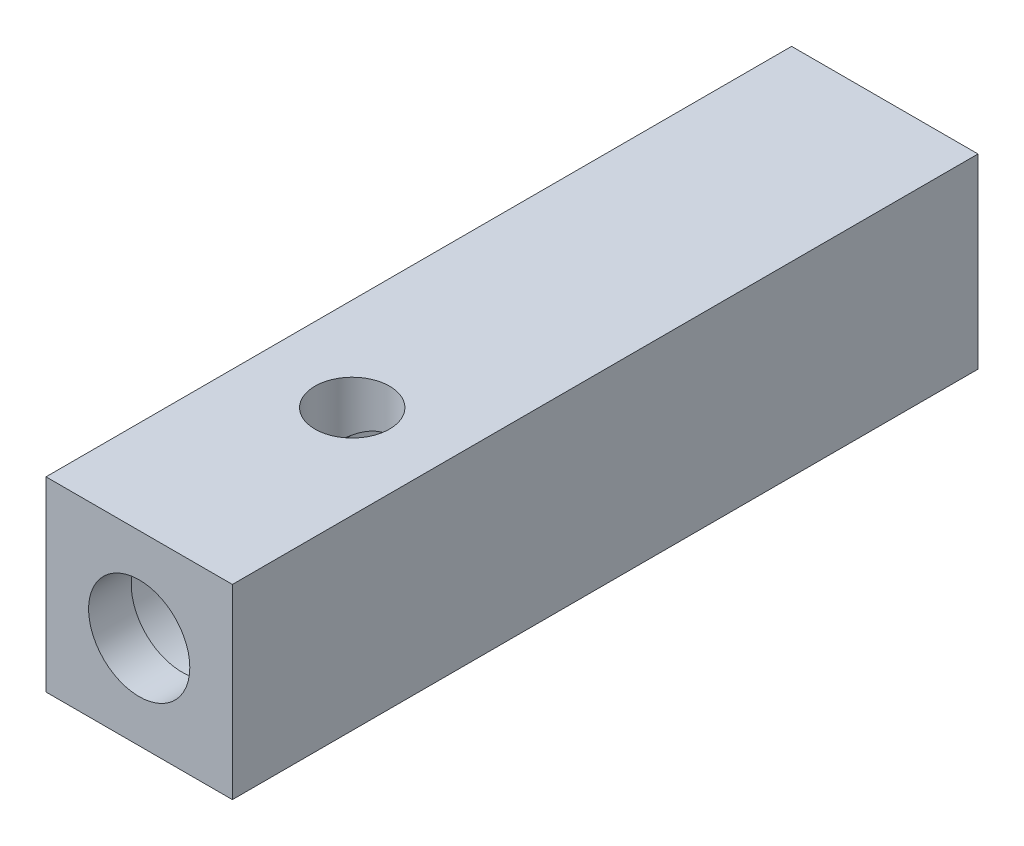
ISO-10303-21;
HEADER;
FILE_DESCRIPTION(('STEP AP214'),'2;1');
FILE_NAME('part.step','',(''),(''),'','','');
FILE_SCHEMA(('AUTOMOTIVE_DESIGN { 1 0 10303 214 1 1 1 1 }'));
ENDSEC;
DATA;
#1=APPLICATION_CONTEXT('core data for automotive mechanical design processes');
#2=APPLICATION_PROTOCOL_DEFINITION('international standard','automotive_design',2000,#1);
#3=PRODUCT_CONTEXT('',#1,'mechanical');
#4=PRODUCT('Part','Part','',(#3));
#5=PRODUCT_RELATED_PRODUCT_CATEGORY('part','',(#4));
#6=PRODUCT_DEFINITION_FORMATION('','',#4);
#7=PRODUCT_DEFINITION_CONTEXT('part definition',#1,'design');
#8=PRODUCT_DEFINITION('design','',#6,#7);
#9=PRODUCT_DEFINITION_SHAPE('','',#8);
#10=(LENGTH_UNIT() NAMED_UNIT(*) SI_UNIT(.MILLI.,.METRE.));
#11=(NAMED_UNIT(*) PLANE_ANGLE_UNIT() SI_UNIT($,.RADIAN.));
#12=(NAMED_UNIT(*) SI_UNIT($,.STERADIAN.) SOLID_ANGLE_UNIT());
#13=UNCERTAINTY_MEASURE_WITH_UNIT(LENGTH_MEASURE(1.E-05),#10,'distance_accuracy_value','');
#14=(GEOMETRIC_REPRESENTATION_CONTEXT(3) GLOBAL_UNCERTAINTY_ASSIGNED_CONTEXT((#13)) GLOBAL_UNIT_ASSIGNED_CONTEXT((#10,
#11,#12)) REPRESENTATION_CONTEXT('',''));
#15=CARTESIAN_POINT('',(0.,0.,0.));
#16=DIRECTION('',(0.,0.,1.));
#17=DIRECTION('',(1.,0.,0.));
#18=AXIS2_PLACEMENT_3D('',#15,#16,#17);
#19=CARTESIAN_POINT('',(-0.749999999999997,-0.854838709677421,130.));
#20=DIRECTION('',(0.,0.,-1.));
#21=DIRECTION('',(-1.,0.,0.));
#22=AXIS2_PLACEMENT_3D('',#19,#20,#21);
#23=CYLINDRICAL_SURFACE('',#22,4.75);
#24=CARTESIAN_POINT('',(-0.750000000000002,-5.60483870967742,33.5));
#25=CARTESIAN_POINT('',(-0.835960235276341,-5.60483892022391,33.5000002182446));
#26=CARTESIAN_POINT('',(-0.921917443498972,-5.60250047964921,33.496828661841));
#27=CARTESIAN_POINT('',(-1.0931473212692,-5.59320394208142,33.484196212037));
#28=CARTESIAN_POINT('',(-1.1784197208088,-5.58624410553636,33.4747329503574));
#29=CARTESIAN_POINT('',(-1.34756129725432,-5.56786886904828,33.4496704863325));
#30=CARTESIAN_POINT('',(-1.43143062071384,-5.55645393751593,33.4340719290535));
#31=CARTESIAN_POINT('',(-1.59718128514274,-5.52943517180864,33.3969855039154));
#32=CARTESIAN_POINT('',(-1.679061747263,-5.51382952125771,33.3754950822711));
#33=CARTESIAN_POINT('',(-1.91998623850274,-5.46140569671407,33.3028923506507));
#34=CARTESIAN_POINT('',(-2.0753828679131,-5.41885812369078,33.2434849718806));
#35=CARTESIAN_POINT('',(-2.37300677003142,-5.32171064524888,33.1052943255271));
#36=CARTESIAN_POINT('',(-2.51523220787309,-5.26710906417225,33.0265083639039));
#37=CARTESIAN_POINT('',(-2.7973436223757,-5.14397308430873,32.8441373772734));
#38=CARTESIAN_POINT('',(-2.93582556798973,-5.07462107872646,32.7389431380303));
#39=CARTESIAN_POINT('',(-3.1944093869012,-4.93029137657298,32.5109068045485));
#40=CARTESIAN_POINT('',(-3.31448336892524,-4.85530539474581,32.3880384663797));
#41=CARTESIAN_POINT('',(-3.49090600459096,-4.73508875808077,32.1789712052844));
#42=CARTESIAN_POINT('',(-3.55348464878972,-4.68999881311107,32.0978552786358));
#43=CARTESIAN_POINT('',(-3.67156137843959,-4.60082944136122,31.9300285315039));
#44=CARTESIAN_POINT('',(-3.72705739807501,-4.55675031247088,31.8433160897181));
#45=CARTESIAN_POINT('',(-3.83057745172816,-4.47105938451772,31.6645408128963));
#46=CARTESIAN_POINT('',(-3.87861105004513,-4.4294444702389,31.5724850376962));
#47=CARTESIAN_POINT('',(-3.96684709051101,-4.35025140654459,31.3830455383964));
#48=CARTESIAN_POINT('',(-4.00705071709724,-4.31267264696761,31.2856626229905));
#49=CARTESIAN_POINT('',(-4.09084182285504,-4.23206746322691,31.052930280201));
#50=CARTESIAN_POINT('',(-4.13122394035352,-4.19128872443804,30.91559341532));
#51=CARTESIAN_POINT('',(-4.19518557475051,-4.12521342144265,30.6336429883523));
#52=CARTESIAN_POINT('',(-4.21880316840151,-4.09988179126655,30.4890467200087));
#53=CARTESIAN_POINT('',(-4.24772910565033,-4.06869869874495,30.1946407372326));
#54=CARTESIAN_POINT('',(-4.25289054771124,-4.06300354546502,30.0447987381071));
#55=CARTESIAN_POINT('',(-4.24399273179437,-4.07268541654341,29.7463366737651));
#56=CARTESIAN_POINT('',(-4.22992102881128,-4.08807608471574,29.5977174623844));
#57=CARTESIAN_POINT('',(-4.18137531080706,-4.13957542076199,29.2913234899478));
#58=CARTESIAN_POINT('',(-4.144920941132,-4.17768303374194,29.1342174184615));
#59=CARTESIAN_POINT('',(-4.05264272092886,-4.26940046845676,28.8304345814692));
#60=CARTESIAN_POINT('',(-3.99677267075352,-4.32304721443486,28.6837837062929));
#61=CARTESIAN_POINT('',(-3.88859825932271,-4.42067566838978,28.4475042977926));
#62=CARTESIAN_POINT('',(-3.84090331128877,-4.46223426837937,28.3546793056552));
#63=CARTESIAN_POINT('',(-3.73801427391982,-4.54790621789404,28.1744762736389));
#64=CARTESIAN_POINT('',(-3.68281795259838,-4.5920203255444,28.0870998662834));
#65=CARTESIAN_POINT('',(-3.56519867241594,-4.6814064874249,27.9178651039498));
#66=CARTESIAN_POINT('',(-3.50276924280806,-4.72667954981198,27.836011795137));
#67=CARTESIAN_POINT('',(-3.37092112966284,-4.81711886570695,27.6780711547123));
#68=CARTESIAN_POINT('',(-3.30150223526948,-4.86228511595047,27.6019839971732));
#69=CARTESIAN_POINT('',(-3.15472617312422,-4.95207006594129,27.454757729243));
#70=CARTESIAN_POINT('',(-3.07726468796293,-4.99667010830168,27.3837110277874));
#71=CARTESIAN_POINT('',(-2.91547996244503,-5.08350583300548,27.248305597915));
#72=CARTESIAN_POINT('',(-2.83115761286572,-5.12574182108674,27.1839460037433));
#73=CARTESIAN_POINT('',(-2.6560297485777,-5.20671571863305,27.0625909510671));
#74=CARTESIAN_POINT('',(-2.56523632609718,-5.24545986137626,27.0055822887843));
#75=CARTESIAN_POINT('',(-2.37747132728796,-5.31846874059756,26.8995211569268));
#76=CARTESIAN_POINT('',(-2.28050207779676,-5.35273514945381,26.8504657152656));
#77=CARTESIAN_POINT('',(-2.03213223215877,-5.431172250699,26.7392379103048));
#78=CARTESIAN_POINT('',(-1.87723908996274,-5.4720291861753,26.6823271189342));
#79=CARTESIAN_POINT('',(-1.55799582319744,-5.53844743912448,26.5904991901329));
#80=CARTESIAN_POINT('',(-1.39365280335538,-5.56402008717532,26.5555657593888));
#81=CARTESIAN_POINT('',(-1.05914917232649,-5.59775596573782,26.5095825029298));
#82=CARTESIAN_POINT('',(-0.888967815571888,-5.6058487395314,26.4986293328553));
#83=CARTESIAN_POINT('',(-0.548947307756921,-5.60362580756333,26.5016459962613));
#84=CARTESIAN_POINT('',(-0.379108152651954,-5.5933103206685,26.5156155334209));
#85=CARTESIAN_POINT('',(-0.0558015782133216,-5.55647773396524,26.5658809205757));
#86=CARTESIAN_POINT('',(0.0980224871730821,-5.53102464018638,26.6007115166988));
#87=CARTESIAN_POINT('',(0.397029181154265,-5.46680484784143,26.6896112295242));
#88=CARTESIAN_POINT('',(0.542209985252461,-5.42803534993969,26.7436843914287));
#89=CARTESIAN_POINT('',(0.832242946594377,-5.33634524975176,26.8737093733923));
#90=CARTESIAN_POINT('',(0.97620352395673,-5.28256289990077,26.951028525703));
#91=CARTESIAN_POINT('',(1.24948743646971,-5.16606336427905,27.1228237449417));
#92=CARTESIAN_POINT('',(1.37880207352696,-5.10334091848265,27.2173099213738));
#93=CARTESIAN_POINT('',(1.64416252012856,-4.96058232699432,27.4400648399105));
#94=CARTESIAN_POINT('',(1.77709933002467,-4.87947970482023,27.5713513376227));
#95=CARTESIAN_POINT('',(2.02037654106611,-4.71605527014465,27.8529793694197));
#96=CARTESIAN_POINT('',(2.13069442799828,-4.63373232950934,28.0033396503974));
#97=CARTESIAN_POINT('',(2.31853300761375,-4.48248417032775,28.3078977864141));
#98=CARTESIAN_POINT('',(2.39810032870962,-4.41301877945663,28.4605595861629));
#99=CARTESIAN_POINT('',(2.53520371737235,-4.28683739429773,28.7803464443351));
#100=CARTESIAN_POINT('',(2.5927853303969,-4.2300951446547,28.9474407136931));
#101=CARTESIAN_POINT('',(2.67201794351727,-4.14948843737931,29.2527608978894));
#102=CARTESIAN_POINT('',(2.69896373511458,-4.12100976440798,29.3883629372417));
#103=CARTESIAN_POINT('',(2.73661775343226,-4.08079437132936,29.6641616676011));
#104=CARTESIAN_POINT('',(2.74735224962139,-4.06903056757511,29.8043505483855));
#105=CARTESIAN_POINT('',(2.75178455340328,-4.06420381499295,30.0857216759805));
#106=CARTESIAN_POINT('',(2.7454359733717,-4.07119178485177,30.2269055871465));
#107=CARTESIAN_POINT('',(2.71613321909268,-4.102737662142,30.5055932471552));
#108=CARTESIAN_POINT('',(2.69315600027368,-4.12731995189973,30.6430916139135));
#109=CARTESIAN_POINT('',(2.62365978492096,-4.19909025266691,30.9482838446297));
#110=CARTESIAN_POINT('',(2.57239318459059,-4.25064518326572,31.1138359662066));
#111=CARTESIAN_POINT('',(2.44840779264907,-4.36766121832534,31.4315825086133));
#112=CARTESIAN_POINT('',(2.37563639417373,-4.43315631318023,31.58374297089));
#113=CARTESIAN_POINT('',(2.24029231563935,-4.54610472899651,31.8219851291503));
#114=CARTESIAN_POINT('',(2.18335217571275,-4.59165247626422,31.9122654275547));
#115=CARTESIAN_POINT('',(2.06181652433762,-4.68393775074415,32.086864053777));
#116=CARTESIAN_POINT('',(1.99722223229462,-4.73067508751027,32.171183327855));
#117=CARTESIAN_POINT('',(1.86056387669929,-4.8240088977339,32.3337171165019));
#118=CARTESIAN_POINT('',(1.78849522416099,-4.87060526635934,32.4119278283632));
#119=CARTESIAN_POINT('',(1.63707984240252,-4.96241569274556,32.5618745665306));
#120=CARTESIAN_POINT('',(1.55773261043076,-5.00762965473165,32.6336101449014));
#121=CARTESIAN_POINT('',(1.39164910343152,-5.09567644817136,32.770370101137));
#122=CARTESIAN_POINT('',(1.30488746459781,-5.13850020424953,32.8353696097816));
#123=CARTESIAN_POINT('',(1.124533934609,-5.22043426260144,32.9576993070876));
#124=CARTESIAN_POINT('',(1.03094600588811,-5.25954668931184,33.0150338910802));
#125=CARTESIAN_POINT('',(0.837482942272111,-5.33290543654738,33.1212260831418));
#126=CARTESIAN_POINT('',(0.737618712517211,-5.36715987801866,33.1700978691821));
#127=CARTESIAN_POINT('',(0.532131269502087,-5.42978803621756,33.2586255691418));
#128=CARTESIAN_POINT('',(0.426510247290423,-5.4581639708481,33.298284959495));
#129=CARTESIAN_POINT('',(0.233595368558578,-5.50270269821314,33.3601330370715));
#130=CARTESIAN_POINT('',(0.147216529163855,-5.52017959903707,33.3842442135132));
#131=CARTESIAN_POINT('',(-0.0279068065408229,-5.55047191626987,33.4258832467202));
#132=CARTESIAN_POINT('',(-0.116650745028688,-5.56328842159748,33.4434126413743));
#133=CARTESIAN_POINT('',(-0.295735691018596,-5.58392558052667,33.4715780849901));
#134=CARTESIAN_POINT('',(-0.386075493272035,-5.59174985148234,33.4822191253088));
#135=CARTESIAN_POINT('',(-0.56761134679428,-5.60220624004334,33.4964298794323));
#136=CARTESIAN_POINT('',(-0.658807376788176,-5.604838486315,33.4999997684709));
#137=CARTESIAN_POINT('',(-0.750000000000002,-5.60483870967742,33.5));
#138=B_SPLINE_CURVE_WITH_KNOTS('',3,(#24,#25,#26,#27,#28,#29,#30,#31,#32,#33,#34,#35,#36,#37,
#38,#39,#40,#41,#42,#43,#44,#45,#46,#47,#48,#49,#50,#51,#52,#53,#54,#55,#56,#57,#58,#59,#60,#61,
#62,#63,#64,#65,#66,#67,#68,#69,#70,#71,#72,#73,#74,#75,#76,#77,#78,#79,#80,#81,#82,#83,#84,#85,
#86,#87,#88,#89,#90,#91,#92,#93,#94,#95,#96,#97,#98,#99,#100,#101,#102,#103,#104,#105,#106,#107,
#108,#109,#110,#111,#112,#113,#114,#115,#116,#117,#118,#119,#120,#121,#122,#123,#124,#125,#126,
#127,#128,#129,#130,#131,#132,#133,#134,#135,#136,#137),.UNSPECIFIED.,.T.,.F.,(4,2,2,2,2,2,2,2,
2,2,2,2,2,2,2,2,2,2,2,2,2,2,2,2,2,2,2,2,2,2,2,2,2,2,2,2,2,2,2,2,2,2,2,2,2,2,2,2,2,2,2,2,2,2,2,2,
4),(0.,0.2577856007201,0.515668290253106,0.773523873186251,1.03149139890406,1.5442023985348,
2.05698471634416,2.61667257627068,3.17720025327256,3.51268407972365,3.84826553545024,
4.18341327654955,4.51851028051266,4.96337320731081,5.40722246913762,5.8545967766865,
6.30226069948906,6.79675625774903,7.29243661832322,7.62904818929507,7.96576013710248,
8.30277566811493,8.63980136915569,8.981932187439,9.32401865598431,9.66548184410365,
10.0068171332068,10.5145311397974,11.0218682984985,11.5312466113961,12.0406188680309,
12.5178319253915,12.99514536255,13.5093274117729,14.023813245376,14.6325789718054,
15.2419477352069,15.7970128751745,16.350921824934,16.7726768674582,17.1937477441812,
17.6159631556711,18.0387648118245,18.5782747472135,19.1191155599946,19.4668912183488,
19.8146115458402,20.1625466392057,20.5105057835326,20.8597069479482,21.2087070015448,
21.5571165862709,21.9053944791134,22.1791407700711,22.4528230580284,22.7263068109511,
22.9997837864425),.UNSPECIFIED.);
#139=CARTESIAN_POINT('',(-0.750000000000002,-5.60483870967742,33.5));
#140=VERTEX_POINT('',#139);
#141=EDGE_CURVE('E263',#140,#140,#138,.T.);
#142=ORIENTED_EDGE('',*,*,#141,.T.);
#143=EDGE_LOOP('',(#142));
#144=FACE_BOUND('',#143,.T.);
#145=CARTESIAN_POINT('',(-0.750000000000002,3.89516129032258,33.5));
#146=CARTESIAN_POINT('',(-0.664039764723662,3.89516150086907,33.5000002182446));
#147=CARTESIAN_POINT('',(-0.578082556501032,3.89282306029437,33.496828661841));
#148=CARTESIAN_POINT('',(-0.406852678730803,3.88352652272658,33.484196212037));
#149=CARTESIAN_POINT('',(-0.321580279191206,3.87656668618152,33.4747329503574));
#150=CARTESIAN_POINT('',(-0.152438702745682,3.85819144969344,33.4496704863325));
#151=CARTESIAN_POINT('',(-0.0685693792861652,3.84677651816109,33.4340719290535));
#152=CARTESIAN_POINT('',(0.0971812851427338,3.8197577524538,33.3969855039154));
#153=CARTESIAN_POINT('',(0.179061747262998,3.80415210190287,33.3754950822711));
#154=CARTESIAN_POINT('',(0.419986238502736,3.75172827735923,33.3028923506507));
#155=CARTESIAN_POINT('',(0.575382867913099,3.70918070433594,33.2434849718806));
#156=CARTESIAN_POINT('',(0.873006770031417,3.61203322589405,33.1052943255271));
#157=CARTESIAN_POINT('',(1.01523220787309,3.55743164481741,33.0265083639039));
#158=CARTESIAN_POINT('',(1.2973436223757,3.43429566495389,32.8441373772734));
#159=CARTESIAN_POINT('',(1.43582556798973,3.36494365937162,32.7389431380303));
#160=CARTESIAN_POINT('',(1.69440938690119,3.22061395721814,32.5109068045485));
#161=CARTESIAN_POINT('',(1.81448336892524,3.14562797539098,32.3880384663797));
#162=CARTESIAN_POINT('',(1.99090600459095,3.02541133872593,32.1789712052844));
#163=CARTESIAN_POINT('',(2.05348464878971,2.98032139375623,32.0978552786358));
#164=CARTESIAN_POINT('',(2.17156137843958,2.89115202200639,31.9300285315039));
#165=CARTESIAN_POINT('',(2.227057398075,2.84707289311605,31.8433160897181));
#166=CARTESIAN_POINT('',(2.33057745172815,2.76138196516289,31.6645408128963));
#167=CARTESIAN_POINT('',(2.37861105004513,2.71976705088407,31.5724850376962));
#168=CARTESIAN_POINT('',(2.466847090511,2.64057398718976,31.3830455383964));
#169=CARTESIAN_POINT('',(2.50705071709723,2.60299522761277,31.2856626229905));
#170=CARTESIAN_POINT('',(2.59084182285503,2.52239004387208,31.052930280201));
#171=CARTESIAN_POINT('',(2.63122394035352,2.4816113050832,30.91559341532));
#172=CARTESIAN_POINT('',(2.69518557475051,2.41553600208782,30.6336429883523));
#173=CARTESIAN_POINT('',(2.71880316840151,2.39020437191172,30.4890467200088));
#174=CARTESIAN_POINT('',(2.74772910565032,2.35902127939012,30.1946407372326));
#175=CARTESIAN_POINT('',(2.75289054771124,2.35332612611018,30.0447987381071));
#176=CARTESIAN_POINT('',(2.74399273179436,2.36300799718858,29.7463366737651));
#177=CARTESIAN_POINT('',(2.72992102881128,2.37839866536091,29.5977174623844));
#178=CARTESIAN_POINT('',(2.68137531080705,2.42989800140715,29.2913234899478));
#179=CARTESIAN_POINT('',(2.644920941132,2.4680056143871,29.1342174184615));
#180=CARTESIAN_POINT('',(2.55264272092886,2.55972304910193,28.8304345814692));
#181=CARTESIAN_POINT('',(2.49677267075352,2.61336979508002,28.6837837062929));
#182=CARTESIAN_POINT('',(2.38859825932271,2.71099824903495,28.4475042977926));
#183=CARTESIAN_POINT('',(2.34090331128876,2.75255684902453,28.3546793056552));
#184=CARTESIAN_POINT('',(2.23801427391981,2.83822879853921,28.1744762736389));
#185=CARTESIAN_POINT('',(2.18281795259838,2.88234290618956,28.0870998662834));
#186=CARTESIAN_POINT('',(2.06519867241593,2.97172906807006,27.9178651039498));
#187=CARTESIAN_POINT('',(2.00276924280806,3.01700213045715,27.836011795137));
#188=CARTESIAN_POINT('',(1.87092112966284,3.10744144635212,27.6780711547123));
#189=CARTESIAN_POINT('',(1.80150223526948,3.15260769659563,27.6019839971732));
#190=CARTESIAN_POINT('',(1.65472617312421,3.24239264658646,27.454757729243));
#191=CARTESIAN_POINT('',(1.57726468796292,3.28699268894685,27.3837110277874));
#192=CARTESIAN_POINT('',(1.41547996244502,3.37382841365064,27.248305597915));
#193=CARTESIAN_POINT('',(1.33115761286571,3.41606440173191,27.1839460037433));
#194=CARTESIAN_POINT('',(1.1560297485777,3.49703829927822,27.0625909510671));
#195=CARTESIAN_POINT('',(1.06523632609718,3.53578244202142,27.0055822887843));
#196=CARTESIAN_POINT('',(0.877471327287953,3.60879132124272,26.8995211569268));
#197=CARTESIAN_POINT('',(0.780502077796755,3.64305773009897,26.8504657152656));
#198=CARTESIAN_POINT('',(0.532132232158763,3.72149483134416,26.7392379103048));
#199=CARTESIAN_POINT('',(0.37723908996273,3.76235176682046,26.6823271189342));
#200=CARTESIAN_POINT('',(0.0579958231974353,3.82877001976964,26.5904991901329));
#201=CARTESIAN_POINT('',(-0.106347196644629,3.85434266782048,26.5555657593888));
#202=CARTESIAN_POINT('',(-0.440850827673513,3.88807854638298,26.5095825029298));
#203=CARTESIAN_POINT('',(-0.611032184428116,3.89617132017656,26.4986293328553));
#204=CARTESIAN_POINT('',(-0.951052692243082,3.89394838820849,26.5016459962613));
#205=CARTESIAN_POINT('',(-1.12089184734805,3.88363290131365,26.5156155334209));
#206=CARTESIAN_POINT('',(-1.44419842178668,3.8468003146104,26.5658809205757));
#207=CARTESIAN_POINT('',(-1.59802248717308,3.82134722083154,26.6007115166988));
#208=CARTESIAN_POINT('',(-1.89702918115427,3.75712742848659,26.6896112295242));
#209=CARTESIAN_POINT('',(-2.04220998525246,3.71835793058485,26.7436843914287));
#210=CARTESIAN_POINT('',(-2.33224294659438,3.62666783039692,26.8737093733923));
#211=CARTESIAN_POINT('',(-2.47620352395673,3.57288548054592,26.951028525703));
#212=CARTESIAN_POINT('',(-2.74948743646971,3.4563859449242,27.1228237449417));
#213=CARTESIAN_POINT('',(-2.87880207352696,3.3936634991278,27.2173099213738));
#214=CARTESIAN_POINT('',(-3.14416252012856,3.25090490763948,27.4400648399105));
#215=CARTESIAN_POINT('',(-3.27709933002467,3.16980228546538,27.5713513376227));
#216=CARTESIAN_POINT('',(-3.52037654106611,3.0063778507898,27.8529793694197));
#217=CARTESIAN_POINT('',(-3.63069442799828,2.92405491015449,28.0033396503974));
#218=CARTESIAN_POINT('',(-3.81853300761375,2.7728067509729,28.3078977864141));
#219=CARTESIAN_POINT('',(-3.89810032870962,2.70334136010178,28.4605595861629));
#220=CARTESIAN_POINT('',(-4.03520371737235,2.57715997494288,28.7803464443351));
#221=CARTESIAN_POINT('',(-4.0927853303969,2.52041772529985,28.9474407136931));
#222=CARTESIAN_POINT('',(-4.17201794351727,2.43981101802446,29.2527608978894));
#223=CARTESIAN_POINT('',(-4.19896373511459,2.41133234505313,29.3883629372417));
#224=CARTESIAN_POINT('',(-4.23661775343226,2.3711169519745,29.6641616676011));
#225=CARTESIAN_POINT('',(-4.24735224962139,2.35935314822026,29.8043505483855));
#226=CARTESIAN_POINT('',(-4.25178455340328,2.3545263956381,30.0857216759805));
#227=CARTESIAN_POINT('',(-4.24543597337171,2.36151436549692,30.2269055871465));
#228=CARTESIAN_POINT('',(-4.21613321909269,2.39306024278715,30.5055932471552));
#229=CARTESIAN_POINT('',(-4.19315600027369,2.41764253254488,30.6430916139135));
#230=CARTESIAN_POINT('',(-4.12365978492096,2.48941283331206,30.9482838446297));
#231=CARTESIAN_POINT('',(-4.07239318459059,2.54096776391087,31.1138359662066));
#232=CARTESIAN_POINT('',(-3.94840779264908,2.65798379897049,31.4315825086133));
#233=CARTESIAN_POINT('',(-3.87563639417374,2.72347889382538,31.58374297089));
#234=CARTESIAN_POINT('',(-3.74029231563936,2.83642730964165,31.8219851291503));
#235=CARTESIAN_POINT('',(-3.68335217571276,2.88197505690937,31.9122654275547));
#236=CARTESIAN_POINT('',(-3.56181652433763,2.97426033138929,32.086864053777));
#237=CARTESIAN_POINT('',(-3.49722223229463,3.02099766815542,32.171183327855));
#238=CARTESIAN_POINT('',(-3.3605638766993,3.11433147837905,32.3337171165019));
#239=CARTESIAN_POINT('',(-3.28849522416099,3.16092784700449,32.4119278283631));
#240=CARTESIAN_POINT('',(-3.13707984240253,3.2527382733907,32.5618745665306));
#241=CARTESIAN_POINT('',(-3.05773261043077,3.2979522353768,32.6336101449014));
#242=CARTESIAN_POINT('',(-2.89164910343154,3.38599902881651,32.770370101137));
#243=CARTESIAN_POINT('',(-2.80488746459782,3.42882278489468,32.8353696097816));
#244=CARTESIAN_POINT('',(-2.62453393460901,3.51075684324659,32.9576993070876));
#245=CARTESIAN_POINT('',(-2.53094600588813,3.54986926995699,33.0150338910802));
#246=CARTESIAN_POINT('',(-2.33748294227213,3.62322801719253,33.1212260831418));
#247=CARTESIAN_POINT('',(-2.23761871251723,3.65748245866382,33.1700978691821));
#248=CARTESIAN_POINT('',(-2.0321312695021,3.72011061686271,33.2586255691418));
#249=CARTESIAN_POINT('',(-1.92651024729043,3.74848655149325,33.298284959495));
#250=CARTESIAN_POINT('',(-1.73359536855859,3.79302527885829,33.3601330370714));
#251=CARTESIAN_POINT('',(-1.64721652916386,3.81050217968222,33.3842442135132));
#252=CARTESIAN_POINT('',(-1.47209319345918,3.84079449691503,33.4258832467202));
#253=CARTESIAN_POINT('',(-1.38334925497132,3.85361100224263,33.4434126413743));
#254=CARTESIAN_POINT('',(-1.20426430898141,3.87424816117182,33.4715780849901));
#255=CARTESIAN_POINT('',(-1.11392450672797,3.88207243212749,33.4822191253088));
#256=CARTESIAN_POINT('',(-0.932388653205727,3.8925288206885,33.4964298794323));
#257=CARTESIAN_POINT('',(-0.841192623211829,3.89516106696015,33.4999997684709));
#258=CARTESIAN_POINT('',(-0.750000000000002,3.89516129032258,33.5));
#259=B_SPLINE_CURVE_WITH_KNOTS('',3,(#145,#146,#147,#148,#149,#150,#151,#152,#153,#154,#155,
#156,#157,#158,#159,#160,#161,#162,#163,#164,#165,#166,#167,#168,#169,#170,#171,#172,#173,#174,
#175,#176,#177,#178,#179,#180,#181,#182,#183,#184,#185,#186,#187,#188,#189,#190,#191,#192,#193,
#194,#195,#196,#197,#198,#199,#200,#201,#202,#203,#204,#205,#206,#207,#208,#209,#210,#211,#212,
#213,#214,#215,#216,#217,#218,#219,#220,#221,#222,#223,#224,#225,#226,#227,#228,#229,#230,#231,
#232,#233,#234,#235,#236,#237,#238,#239,#240,#241,#242,#243,#244,#245,#246,#247,#248,#249,#250,
#251,#252,#253,#254,#255,#256,#257,#258),.UNSPECIFIED.,.T.,.F.,(4,2,2,2,2,2,2,2,2,2,2,2,2,2,2,2,
2,2,2,2,2,2,2,2,2,2,2,2,2,2,2,2,2,2,2,2,2,2,2,2,2,2,2,2,2,2,2,2,2,2,2,2,2,2,2,2,4),(0.,
0.257785600720099,0.515668290253104,0.77352387318625,1.03149139890406,1.5442023985348,
2.05698471634416,2.61667257627068,3.17720025327256,3.51268407972364,3.84826553545023,
4.18341327654955,4.51851028051265,4.9633732073108,5.40722246913761,5.85459677668649,
6.30226069948906,6.79675625774903,7.29243661832322,7.62904818929507,7.96576013710248,
8.30277566811492,8.63980136915569,8.981932187439,9.32401865598431,9.66548184410365,
10.0068171332068,10.5145311397974,11.0218682984985,11.5312466113961,12.0406188680309,
12.5178319253915,12.99514536255,13.5093274117729,14.023813245376,14.6325789718054,
15.2419477352069,15.7970128751745,16.350921824934,16.7726768674582,17.1937477441812,
17.6159631556711,18.0387648118245,18.5782747472135,19.1191155599946,19.4668912183488,
19.8146115458402,20.1625466392057,20.5105057835326,20.8597069479482,21.2087070015448,
21.5571165862709,21.9053944791134,22.1791407700711,22.4528230580284,22.7263068109511,
22.9997837864425),.UNSPECIFIED.);
#260=CARTESIAN_POINT('',(-0.750000000000002,3.89516129032258,33.5));
#261=VERTEX_POINT('',#260);
#262=EDGE_CURVE('E257',#261,#261,#259,.T.);
#263=ORIENTED_EDGE('',*,*,#262,.T.);
#264=EDGE_LOOP('',(#263));
#265=FACE_BOUND('',#264,.T.);
#266=CARTESIAN_POINT('',(-0.749999999999997,-0.854838709677421,50.));
#267=DIRECTION('',(0.,0.,1.));
#268=DIRECTION('',(1.,0.,0.));
#269=AXIS2_PLACEMENT_3D('',#266,#267,#268);
#270=CIRCLE('',#269,4.75);
#271=CARTESIAN_POINT('',(4.,-0.854838709677421,50.));
#272=VERTEX_POINT('',#271);
#273=EDGE_CURVE('E268',#272,#272,#270,.T.);
#274=ORIENTED_EDGE('',*,*,#273,.T.);
#275=EDGE_LOOP('',(#274));
#276=FACE_BOUND('',#275,.T.);
#277=CARTESIAN_POINT('',(-0.749999999999997,-0.854838709677421,41.));
#278=DIRECTION('',(0.,0.,1.));
#279=DIRECTION('',(1.,0.,0.));
#280=AXIS2_PLACEMENT_3D('',#277,#278,#279);
#281=CIRCLE('',#280,4.75);
#282=CARTESIAN_POINT('',(-3.34954384407455,3.12069544345648,41.));
#283=VERTEX_POINT('',#282);
#284=CARTESIAN_POINT('',(3.28887360535088,1.64516129032258,41.));
#285=VERTEX_POINT('',#284);
#286=EDGE_CURVE('E167',#283,#285,#281,.F.);
#287=ORIENTED_EDGE('',*,*,#286,.F.);
#288=DIRECTION('',(0.,0.,1.));
#289=VECTOR('',#288,1.);
#290=CARTESIAN_POINT('',(-3.34954384407455,3.12069544345648,41.));
#291=LINE('',#290,#289);
#292=CARTESIAN_POINT('',(-3.34954384407455,3.12069544345648,46.));
#293=VERTEX_POINT('',#292);
#294=EDGE_CURVE('E175',#283,#293,#291,.T.);
#295=ORIENTED_EDGE('',*,*,#294,.T.);
#296=CARTESIAN_POINT('',(-0.749999999999997,-0.854838709677421,46.));
#297=DIRECTION('',(0.,0.,1.));
#298=DIRECTION('',(1.,0.,0.));
#299=AXIS2_PLACEMENT_3D('',#296,#297,#298);
#300=CIRCLE('',#299,4.75);
#301=CARTESIAN_POINT('',(3.28887360535088,-3.35483870967742,46.));
#302=VERTEX_POINT('',#301);
#303=EDGE_CURVE('E63',#293,#302,#300,.F.);
#304=ORIENTED_EDGE('',*,*,#303,.T.);
#305=DIRECTION('',(0.,0.,-1.));
#306=VECTOR('',#305,1.);
#307=CARTESIAN_POINT('',(3.28887360535088,-3.35483870967742,130.));
#308=LINE('',#307,#306);
#309=CARTESIAN_POINT('',(3.28887360535088,-3.35483870967742,-20.));
#310=VERTEX_POINT('',#309);
#311=EDGE_CURVE('E388',#302,#310,#308,.T.);
#312=ORIENTED_EDGE('',*,*,#311,.T.);
#313=CARTESIAN_POINT('',(-0.749999999999997,-0.854838709677421,-20.));
#314=DIRECTION('',(0.,0.,-1.));
#315=DIRECTION('',(-1.,0.,0.));
#316=AXIS2_PLACEMENT_3D('',#313,#314,#315);
#317=CIRCLE('',#316,4.75);
#318=CARTESIAN_POINT('',(-4.78887360535087,-3.35483870967742,-20.));
#319=VERTEX_POINT('',#318);
#320=EDGE_CURVE('E262',#310,#319,#317,.T.);
#321=ORIENTED_EDGE('',*,*,#320,.T.);
#322=DIRECTION('',(0.,0.,-1.));
#323=VECTOR('',#322,1.);
#324=CARTESIAN_POINT('',(-4.78887360535087,-3.35483870967742,130.));
#325=LINE('',#324,#323);
#326=CARTESIAN_POINT('',(-4.78887360535087,-3.35483870967742,41.));
#327=VERTEX_POINT('',#326);
#328=EDGE_CURVE('E50',#319,#327,#325,.F.);
#329=ORIENTED_EDGE('',*,*,#328,.T.);
#330=CARTESIAN_POINT('',(-0.749999999999997,-0.854838709677421,41.));
#331=DIRECTION('',(0.,0.,1.));
#332=DIRECTION('',(1.,0.,0.));
#333=AXIS2_PLACEMENT_3D('',#330,#331,#332);
#334=CIRCLE('',#333,4.75);
#335=CARTESIAN_POINT('',(1.84954384407455,-4.83037286281133,41.));
#336=VERTEX_POINT('',#335);
#337=EDGE_CURVE('E189',#336,#327,#334,.F.);
#338=ORIENTED_EDGE('',*,*,#337,.F.);
#339=DIRECTION('',(0.,0.,1.));
#340=VECTOR('',#339,1.);
#341=CARTESIAN_POINT('',(1.84954384407455,-4.83037286281133,41.));
#342=LINE('',#341,#340);
#343=CARTESIAN_POINT('',(1.84954384407455,-4.83037286281133,46.));
#344=VERTEX_POINT('',#343);
#345=EDGE_CURVE('E203',#336,#344,#342,.T.);
#346=ORIENTED_EDGE('',*,*,#345,.T.);
#347=CARTESIAN_POINT('',(-4.78887360535087,1.64516129032258,46.));
#348=VERTEX_POINT('',#347);
#349=EDGE_CURVE('E56',#344,#348,#300,.F.);
#350=ORIENTED_EDGE('',*,*,#349,.T.);
#351=DIRECTION('',(0.,0.,-1.));
#352=VECTOR('',#351,1.);
#353=CARTESIAN_POINT('',(-4.78887360535087,1.64516129032258,130.));
#354=LINE('',#353,#352);
#355=CARTESIAN_POINT('',(-4.78887360535087,1.64516129032258,-20.));
#356=VERTEX_POINT('',#355);
#357=EDGE_CURVE('E11',#348,#356,#354,.T.);
#358=ORIENTED_EDGE('',*,*,#357,.T.);
#359=CARTESIAN_POINT('',(3.28887360535088,1.64516129032258,-20.));
#360=VERTEX_POINT('',#359);
#361=EDGE_CURVE('E264',#356,#360,#317,.T.);
#362=ORIENTED_EDGE('',*,*,#361,.T.);
#363=DIRECTION('',(0.,0.,-1.));
#364=VECTOR('',#363,1.);
#365=CARTESIAN_POINT('',(3.28887360535088,1.64516129032258,130.));
#366=LINE('',#365,#364);
#367=EDGE_CURVE('E380',#360,#285,#366,.F.);
#368=ORIENTED_EDGE('',*,*,#367,.T.);
#369=EDGE_LOOP('',(#287,#295,#304,#312,#321,#329,#338,#346,#350,#358,#362,#368));
#370=FACE_BOUND('',#369,.T.);
#371=ADVANCED_FACE('F41',(#144,#265,#276,#370),#23,.F.);
#372=CARTESIAN_POINT('',(-7.28834841531101,1.64516129032258,-34.8660687473185));
#373=DIRECTION('',(0.,1.,0.));
#374=DIRECTION('',(0.,0.,1.));
#375=AXIS2_PLACEMENT_3D('',#372,#373,#374);
#376=PLANE('',#375);
#377=DIRECTION('',(1.,0.,0.));
#378=VECTOR('',#377,1.);
#379=CARTESIAN_POINT('',(-7.28834841531101,1.64516129032258,41.));
#380=LINE('',#379,#378);
#381=CARTESIAN_POINT('',(5.78834841531101,1.64516129032258,41.));
#382=VERTEX_POINT('',#381);
#383=EDGE_CURVE('E161',#285,#382,#380,.T.);
#384=ORIENTED_EDGE('',*,*,#383,.F.);
#385=ORIENTED_EDGE('',*,*,#367,.F.);
#386=DIRECTION('',(1.,0.,0.));
#387=VECTOR('',#386,1.);
#388=CARTESIAN_POINT('',(-7.28834841531101,1.64516129032258,-20.));
#389=LINE('',#388,#387);
#390=CARTESIAN_POINT('',(5.78834841531101,1.64516129032258,-20.));
#391=VERTEX_POINT('',#390);
#392=EDGE_CURVE('E218',#360,#391,#389,.T.);
#393=ORIENTED_EDGE('',*,*,#392,.T.);
#394=DIRECTION('',(0.,0.,1.));
#395=VECTOR('',#394,1.);
#396=CARTESIAN_POINT('',(5.78834841531101,1.64516129032258,-34.8660687473185));
#397=LINE('',#396,#395);
#398=EDGE_CURVE('E241',#391,#382,#397,.T.);
#399=ORIENTED_EDGE('',*,*,#398,.T.);
#400=EDGE_LOOP('',(#384,#385,#393,#399));
#401=FACE_BOUND('',#400,.T.);
#402=ADVANCED_FACE('F345',(#401),#376,.F.);
#403=CARTESIAN_POINT('',(5.78834841531101,-3.35483870967742,-34.8660687473185));
#404=DIRECTION('',(0.,-1.,0.));
#405=DIRECTION('',(1.,0.,0.));
#406=AXIS2_PLACEMENT_3D('',#403,#404,#405);
#407=PLANE('',#406);
#408=DIRECTION('',(-1.,0.,0.));
#409=VECTOR('',#408,1.);
#410=CARTESIAN_POINT('',(5.78834841531101,-3.35483870967742,41.));
#411=LINE('',#410,#409);
#412=CARTESIAN_POINT('',(-7.28834841531101,-3.35483870967742,41.));
#413=VERTEX_POINT('',#412);
#414=EDGE_CURVE('E206',#327,#413,#411,.T.);
#415=ORIENTED_EDGE('',*,*,#414,.F.);
#416=ORIENTED_EDGE('',*,*,#328,.F.);
#417=DIRECTION('',(-1.,0.,0.));
#418=VECTOR('',#417,1.);
#419=CARTESIAN_POINT('',(5.78834841531101,-3.35483870967742,-20.));
#420=LINE('',#419,#418);
#421=CARTESIAN_POINT('',(-7.28834841531101,-3.35483870967742,-20.));
#422=VERTEX_POINT('',#421);
#423=EDGE_CURVE('E226',#319,#422,#420,.T.);
#424=ORIENTED_EDGE('',*,*,#423,.T.);
#425=DIRECTION('',(0.,0.,1.));
#426=VECTOR('',#425,1.);
#427=CARTESIAN_POINT('',(-7.28834841531101,-3.35483870967742,-34.8660687473185));
#428=LINE('',#427,#426);
#429=EDGE_CURVE('E237',#422,#413,#428,.T.);
#430=ORIENTED_EDGE('',*,*,#429,.T.);
#431=EDGE_LOOP('',(#415,#416,#424,#430));
#432=FACE_BOUND('',#431,.T.);
#433=ADVANCED_FACE('F342',(#432),#407,.F.);
#434=CARTESIAN_POINT('',(-9.5,7.89516129032258,50.));
#435=DIRECTION('',(1.,0.,0.));
#436=DIRECTION('',(0.,1.,0.));
#437=AXIS2_PLACEMENT_3D('',#434,#435,#436);
#438=PLANE('',#437);
#439=DIRECTION('',(0.,-1.,0.));
#440=VECTOR('',#439,1.);
#441=CARTESIAN_POINT('',(-9.5,7.89516129032258,-20.));
#442=LINE('',#441,#440);
#443=CARTESIAN_POINT('',(-9.5,7.89516129032258,-20.));
#444=VERTEX_POINT('',#443);
#445=CARTESIAN_POINT('',(-9.5,-9.60483870967742,-20.));
#446=VERTEX_POINT('',#445);
#447=EDGE_CURVE('E272',#444,#446,#442,.T.);
#448=ORIENTED_EDGE('',*,*,#447,.T.);
#449=DIRECTION('',(0.,0.,-1.));
#450=VECTOR('',#449,1.);
#451=CARTESIAN_POINT('',(-9.5,-9.60483870967742,50.));
#452=LINE('',#451,#450);
#453=CARTESIAN_POINT('',(-9.5,-9.60483870967742,50.));
#454=VERTEX_POINT('',#453);
#455=EDGE_CURVE('E310',#454,#446,#452,.T.);
#456=ORIENTED_EDGE('',*,*,#455,.F.);
#457=DIRECTION('',(0.,-1.,0.));
#458=VECTOR('',#457,1.);
#459=CARTESIAN_POINT('',(-9.5,7.89516129032258,50.));
#460=LINE('',#459,#458);
#461=CARTESIAN_POINT('',(-9.5,7.89516129032258,50.));
#462=VERTEX_POINT('',#461);
#463=EDGE_CURVE('E273',#462,#454,#460,.T.);
#464=ORIENTED_EDGE('',*,*,#463,.F.);
#465=DIRECTION('',(0.,0.,-1.));
#466=VECTOR('',#465,1.);
#467=CARTESIAN_POINT('',(-9.5,7.89516129032258,50.));
#468=LINE('',#467,#466);
#469=EDGE_CURVE('E287',#462,#444,#468,.T.);
#470=ORIENTED_EDGE('',*,*,#469,.T.);
#471=EDGE_LOOP('',(#448,#456,#464,#470));
#472=FACE_BOUND('',#471,.T.);
#473=ADVANCED_FACE('F43',(#472),#438,.F.);
#474=CARTESIAN_POINT('',(-9.5,-9.60483870967742,50.));
#475=DIRECTION('',(0.,1.,0.));
#476=DIRECTION('',(0.,0.,1.));
#477=AXIS2_PLACEMENT_3D('',#474,#475,#476);
#478=PLANE('',#477);
#479=CARTESIAN_POINT('',(-0.750000000000002,-9.60483870967742,30.));
#480=DIRECTION('',(0.,1.,0.));
#481=DIRECTION('',(0.,0.,1.));
#482=AXIS2_PLACEMENT_3D('',#479,#480,#481);
#483=CIRCLE('',#482,3.5);
#484=CARTESIAN_POINT('',(-0.750000000000002,-9.60483870967742,33.5));
#485=VERTEX_POINT('',#484);
#486=EDGE_CURVE('E258',#485,#485,#483,.T.);
#487=ORIENTED_EDGE('',*,*,#486,.T.);
#488=EDGE_LOOP('',(#487));
#489=FACE_BOUND('',#488,.T.);
#490=DIRECTION('',(1.,0.,0.));
#491=VECTOR('',#490,1.);
#492=CARTESIAN_POINT('',(-9.5,-9.60483870967742,-20.));
#493=LINE('',#492,#491);
#494=CARTESIAN_POINT('',(8.00000000000001,-9.60483870967742,-20.));
#495=VERTEX_POINT('',#494);
#496=EDGE_CURVE('E291',#446,#495,#493,.T.);
#497=ORIENTED_EDGE('',*,*,#496,.T.);
#498=DIRECTION('',(0.,0.,-1.));
#499=VECTOR('',#498,1.);
#500=CARTESIAN_POINT('',(8.00000000000001,-9.60483870967742,50.));
#501=LINE('',#500,#499);
#502=CARTESIAN_POINT('',(8.00000000000001,-9.60483870967742,50.));
#503=VERTEX_POINT('',#502);
#504=EDGE_CURVE('E306',#503,#495,#501,.T.);
#505=ORIENTED_EDGE('',*,*,#504,.F.);
#506=DIRECTION('',(1.,0.,0.));
#507=VECTOR('',#506,1.);
#508=CARTESIAN_POINT('',(-9.5,-9.60483870967742,50.));
#509=LINE('',#508,#507);
#510=EDGE_CURVE('E277',#454,#503,#509,.T.);
#511=ORIENTED_EDGE('',*,*,#510,.F.);
#512=ORIENTED_EDGE('',*,*,#455,.T.);
#513=EDGE_LOOP('',(#497,#505,#511,#512));
#514=FACE_BOUND('',#513,.T.);
#515=ADVANCED_FACE('F462',(#489,#514),#478,.F.);
#516=CARTESIAN_POINT('',(8.,7.89516129032258,50.));
#517=DIRECTION('',(-1.,0.,0.));
#518=DIRECTION('',(0.,-1.,0.));
#519=AXIS2_PLACEMENT_3D('',#516,#517,#518);
#520=PLANE('',#519);
#521=DIRECTION('',(0.,1.,0.));
#522=VECTOR('',#521,1.);
#523=CARTESIAN_POINT('',(8.,7.89516129032258,-20.));
#524=LINE('',#523,#522);
#525=CARTESIAN_POINT('',(8.,7.89516129032258,-20.));
#526=VERTEX_POINT('',#525);
#527=EDGE_CURVE('E294',#495,#526,#524,.T.);
#528=ORIENTED_EDGE('',*,*,#527,.T.);
#529=DIRECTION('',(0.,0.,-1.));
#530=VECTOR('',#529,1.);
#531=CARTESIAN_POINT('',(8.,7.89516129032258,50.));
#532=LINE('',#531,#530);
#533=CARTESIAN_POINT('',(8.,7.89516129032258,50.));
#534=VERTEX_POINT('',#533);
#535=EDGE_CURVE('E302',#534,#526,#532,.T.);
#536=ORIENTED_EDGE('',*,*,#535,.F.);
#537=DIRECTION('',(0.,1.,0.));
#538=VECTOR('',#537,1.);
#539=CARTESIAN_POINT('',(8.,7.89516129032258,50.));
#540=LINE('',#539,#538);
#541=EDGE_CURVE('E281',#503,#534,#540,.T.);
#542=ORIENTED_EDGE('',*,*,#541,.F.);
#543=ORIENTED_EDGE('',*,*,#504,.T.);
#544=EDGE_LOOP('',(#528,#536,#542,#543));
#545=FACE_BOUND('',#544,.T.);
#546=ADVANCED_FACE('F455',(#545),#520,.F.);
#547=CARTESIAN_POINT('',(-9.5,7.89516129032258,50.));
#548=DIRECTION('',(0.,-1.,0.));
#549=DIRECTION('',(0.,0.,-1.));
#550=AXIS2_PLACEMENT_3D('',#547,#548,#549);
#551=PLANE('',#550);
#552=CARTESIAN_POINT('',(-0.750000000000002,7.89516129032258,30.));
#553=DIRECTION('',(0.,1.,0.));
#554=DIRECTION('',(0.,0.,1.));
#555=AXIS2_PLACEMENT_3D('',#552,#553,#554);
#556=CIRCLE('',#555,3.5);
#557=CARTESIAN_POINT('',(-0.750000000000002,7.89516129032258,33.5));
#558=VERTEX_POINT('',#557);
#559=EDGE_CURVE('E253',#558,#558,#556,.T.);
#560=ORIENTED_EDGE('',*,*,#559,.F.);
#561=EDGE_LOOP('',(#560));
#562=FACE_BOUND('',#561,.T.);
#563=DIRECTION('',(-1.,0.,0.));
#564=VECTOR('',#563,1.);
#565=CARTESIAN_POINT('',(-9.5,7.89516129032258,-20.));
#566=LINE('',#565,#564);
#567=EDGE_CURVE('E278',#526,#444,#566,.T.);
#568=ORIENTED_EDGE('',*,*,#567,.T.);
#569=ORIENTED_EDGE('',*,*,#469,.F.);
#570=DIRECTION('',(-1.,0.,0.));
#571=VECTOR('',#570,1.);
#572=CARTESIAN_POINT('',(-9.5,7.89516129032258,50.));
#573=LINE('',#572,#571);
#574=EDGE_CURVE('E284',#534,#462,#573,.T.);
#575=ORIENTED_EDGE('',*,*,#574,.F.);
#576=ORIENTED_EDGE('',*,*,#535,.T.);
#577=EDGE_LOOP('',(#568,#569,#575,#576));
#578=FACE_BOUND('',#577,.T.);
#579=ADVANCED_FACE('F447',(#562,#578),#551,.F.);
#580=CARTESIAN_POINT('',(0.,0.,50.));
#581=DIRECTION('',(0.,0.,1.));
#582=DIRECTION('',(1.,0.,0.));
#583=AXIS2_PLACEMENT_3D('',#580,#581,#582);
#584=PLANE('',#583);
#585=ORIENTED_EDGE('',*,*,#273,.F.);
#586=EDGE_LOOP('',(#585));
#587=FACE_BOUND('',#586,.T.);
#588=ORIENTED_EDGE('',*,*,#463,.T.);
#589=ORIENTED_EDGE('',*,*,#510,.T.);
#590=ORIENTED_EDGE('',*,*,#541,.T.);
#591=ORIENTED_EDGE('',*,*,#574,.T.);
#592=EDGE_LOOP('',(#588,#589,#590,#591));
#593=FACE_BOUND('',#592,.T.);
#594=ADVANCED_FACE('F440',(#587,#593),#584,.T.);
#595=CARTESIAN_POINT('',(0.,0.,-20.));
#596=DIRECTION('',(0.,0.,1.));
#597=DIRECTION('',(1.,0.,0.));
#598=AXIS2_PLACEMENT_3D('',#595,#596,#597);
#599=PLANE('',#598);
#600=ORIENTED_EDGE('',*,*,#361,.F.);
#601=CARTESIAN_POINT('',(-7.28834841531101,1.64516129032258,-20.));
#602=VERTEX_POINT('',#601);
#603=EDGE_CURVE('E220',#602,#356,#389,.T.);
#604=ORIENTED_EDGE('',*,*,#603,.F.);
#605=CARTESIAN_POINT('',(-0.749999999999997,-0.854838709677421,-20.));
#606=DIRECTION('',(0.,0.,1.));
#607=DIRECTION('',(1.,0.,0.));
#608=AXIS2_PLACEMENT_3D('',#605,#606,#607);
#609=CIRCLE('',#608,7.);
#610=EDGE_CURVE('E223',#422,#602,#609,.F.);
#611=ORIENTED_EDGE('',*,*,#610,.F.);
#612=ORIENTED_EDGE('',*,*,#423,.F.);
#613=ORIENTED_EDGE('',*,*,#320,.F.);
#614=CARTESIAN_POINT('',(5.78834841531101,-3.35483870967743,-20.));
#615=VERTEX_POINT('',#614);
#616=EDGE_CURVE('E250',#615,#310,#420,.T.);
#617=ORIENTED_EDGE('',*,*,#616,.F.);
#618=CARTESIAN_POINT('',(-0.749999999999997,-0.854838709677421,-20.));
#619=DIRECTION('',(0.,0.,1.));
#620=DIRECTION('',(1.,0.,0.));
#621=AXIS2_PLACEMENT_3D('',#618,#619,#620);
#622=CIRCLE('',#621,7.);
#623=EDGE_CURVE('E215',#391,#615,#622,.F.);
#624=ORIENTED_EDGE('',*,*,#623,.F.);
#625=ORIENTED_EDGE('',*,*,#392,.F.);
#626=EDGE_LOOP('',(#600,#604,#611,#612,#613,#617,#624,#625));
#627=FACE_BOUND('',#626,.T.);
#628=ORIENTED_EDGE('',*,*,#447,.F.);
#629=ORIENTED_EDGE('',*,*,#567,.F.);
#630=ORIENTED_EDGE('',*,*,#527,.F.);
#631=ORIENTED_EDGE('',*,*,#496,.F.);
#632=EDGE_LOOP('',(#628,#629,#630,#631));
#633=FACE_BOUND('',#632,.T.);
#634=ADVANCED_FACE('F405',(#627,#633),#599,.F.);
#635=CARTESIAN_POINT('',(-0.750000000000002,-17.1048387096774,30.));
#636=DIRECTION('',(0.,1.,0.));
#637=DIRECTION('',(0.,0.,1.));
#638=AXIS2_PLACEMENT_3D('',#635,#636,#637);
#639=CYLINDRICAL_SURFACE('',#638,3.5);
#640=ORIENTED_EDGE('',*,*,#559,.T.);
#641=EDGE_LOOP('',(#640));
#642=FACE_BOUND('',#641,.T.);
#643=ORIENTED_EDGE('',*,*,#262,.F.);
#644=EDGE_LOOP('',(#643));
#645=FACE_BOUND('',#644,.T.);
#646=ADVANCED_FACE('F333',(#642,#645),#639,.F.);
#647=ORIENTED_EDGE('',*,*,#141,.F.);
#648=EDGE_LOOP('',(#647));
#649=FACE_BOUND('',#648,.T.);
#650=ORIENTED_EDGE('',*,*,#486,.F.);
#651=EDGE_LOOP('',(#650));
#652=FACE_BOUND('',#651,.T.);
#653=ADVANCED_FACE('F328',(#649,#652),#639,.F.);
#654=CARTESIAN_POINT('',(-0.749999999999997,-0.854838709677421,46.));
#655=DIRECTION('',(0.,0.,1.));
#656=DIRECTION('',(1.,0.,0.));
#657=AXIS2_PLACEMENT_3D('',#654,#655,#656);
#658=PLANE('',#657);
#659=DIRECTION('',(1.,0.,0.));
#660=VECTOR('',#659,1.);
#661=CARTESIAN_POINT('',(5.78834841531101,-3.35483870967742,46.));
#662=LINE('',#661,#660);
#663=CARTESIAN_POINT('',(5.78834841531101,-3.35483870967743,46.));
#664=VERTEX_POINT('',#663);
#665=EDGE_CURVE('E229',#302,#664,#662,.T.);
#666=ORIENTED_EDGE('',*,*,#665,.F.);
#667=ORIENTED_EDGE('',*,*,#303,.F.);
#668=DIRECTION('',(-0.547272388226221,0.836954558554506,0.));
#669=VECTOR('',#668,1.);
#670=CARTESIAN_POINT('',(-0.916921834735462,-0.599561824693455,46.));
#671=LINE('',#670,#669);
#672=CARTESIAN_POINT('',(-4.58090671758355,5.00384320020412,46.));
#673=VERTEX_POINT('',#672);
#674=EDGE_CURVE('E382',#293,#673,#671,.T.);
#675=ORIENTED_EDGE('',*,*,#674,.T.);
#676=CARTESIAN_POINT('',(-0.749999999999997,-0.854838709677421,46.));
#677=DIRECTION('',(0.,0.,1.));
#678=DIRECTION('',(1.,0.,0.));
#679=AXIS2_PLACEMENT_3D('',#676,#677,#678);
#680=CIRCLE('',#679,7.);
#681=EDGE_CURVE('E181',#664,#673,#680,.T.);
#682=ORIENTED_EDGE('',*,*,#681,.F.);
#683=EDGE_LOOP('',(#666,#667,#675,#682));
#684=FACE_BOUND('',#683,.T.);
#685=ADVANCED_FACE('F332',(#684),#658,.F.);
#686=ORIENTED_EDGE('',*,*,#665,.T.);
#687=DIRECTION('',(0.,0.,1.));
#688=VECTOR('',#687,1.);
#689=CARTESIAN_POINT('',(5.78834841531101,-3.35483870967743,-34.8660687473185));
#690=LINE('',#689,#688);
#691=EDGE_CURVE('E244',#615,#664,#690,.T.);
#692=ORIENTED_EDGE('',*,*,#691,.F.);
#693=ORIENTED_EDGE('',*,*,#616,.T.);
#694=ORIENTED_EDGE('',*,*,#311,.F.);
#695=EDGE_LOOP('',(#686,#692,#693,#694));
#696=FACE_BOUND('',#695,.T.);
#697=ADVANCED_FACE('F347',(#696),#407,.F.);
#698=CARTESIAN_POINT('',(-0.749999999999997,-0.854838709677421,-34.8660687473185));
#699=DIRECTION('',(0.,0.,1.));
#700=DIRECTION('',(1.,0.,0.));
#701=AXIS2_PLACEMENT_3D('',#698,#699,#700);
#702=CYLINDRICAL_SURFACE('',#701,7.);
#703=ORIENTED_EDGE('',*,*,#681,.T.);
#704=DIRECTION('',(0.,0.,1.));
#705=VECTOR('',#704,1.);
#706=CARTESIAN_POINT('',(-4.58090671758355,5.00384320020412,41.));
#707=LINE('',#706,#705);
#708=CARTESIAN_POINT('',(-4.58090671758355,5.00384320020412,41.));
#709=VERTEX_POINT('',#708);
#710=EDGE_CURVE('E173',#709,#673,#707,.T.);
#711=ORIENTED_EDGE('',*,*,#710,.F.);
#712=CARTESIAN_POINT('',(-0.750000000000001,-0.854838709677421,41.));
#713=DIRECTION('',(0.,0.,1.));
#714=DIRECTION('',(1.,0.,0.));
#715=AXIS2_PLACEMENT_3D('',#712,#713,#714);
#716=CIRCLE('',#715,7.);
#717=EDGE_CURVE('E155',#382,#709,#716,.T.);
#718=ORIENTED_EDGE('',*,*,#717,.F.);
#719=ORIENTED_EDGE('',*,*,#398,.F.);
#720=ORIENTED_EDGE('',*,*,#623,.T.);
#721=ORIENTED_EDGE('',*,*,#691,.T.);
#722=EDGE_LOOP('',(#703,#711,#718,#719,#720,#721));
#723=FACE_BOUND('',#722,.T.);
#724=ADVANCED_FACE('F178',(#723),#702,.F.);
#725=DIRECTION('',(-1.,0.,0.));
#726=VECTOR('',#725,1.);
#727=CARTESIAN_POINT('',(-7.28834841531101,1.64516129032258,46.));
#728=LINE('',#727,#726);
#729=CARTESIAN_POINT('',(-7.28834841531101,1.64516129032258,46.));
#730=VERTEX_POINT('',#729);
#731=EDGE_CURVE('E234',#348,#730,#728,.T.);
#732=ORIENTED_EDGE('',*,*,#731,.T.);
#733=DIRECTION('',(0.,0.,1.));
#734=VECTOR('',#733,1.);
#735=CARTESIAN_POINT('',(-7.28834841531101,1.64516129032258,-34.8660687473185));
#736=LINE('',#735,#734);
#737=EDGE_CURVE('E219',#602,#730,#736,.T.);
#738=ORIENTED_EDGE('',*,*,#737,.F.);
#739=ORIENTED_EDGE('',*,*,#603,.T.);
#740=ORIENTED_EDGE('',*,*,#357,.F.);
#741=EDGE_LOOP('',(#732,#738,#739,#740));
#742=FACE_BOUND('',#741,.T.);
#743=ADVANCED_FACE('F350',(#742),#376,.F.);
#744=ORIENTED_EDGE('',*,*,#731,.F.);
#745=ORIENTED_EDGE('',*,*,#349,.F.);
#746=DIRECTION('',(-0.547272388226221,0.836954558554506,0.));
#747=VECTOR('',#746,1.);
#748=CARTESIAN_POINT('',(-0.916921834735462,-0.599561824693455,46.));
#749=LINE('',#748,#747);
#750=CARTESIAN_POINT('',(3.08090671758355,-6.71352061955896,46.));
#751=VERTEX_POINT('',#750);
#752=EDGE_CURVE('E185',#751,#344,#749,.T.);
#753=ORIENTED_EDGE('',*,*,#752,.F.);
#754=CARTESIAN_POINT('',(-0.749999999999997,-0.854838709677421,46.));
#755=DIRECTION('',(0.,0.,1.));
#756=DIRECTION('',(1.,0.,0.));
#757=AXIS2_PLACEMENT_3D('',#754,#755,#756);
#758=CIRCLE('',#757,7.);
#759=EDGE_CURVE('E214',#730,#751,#758,.T.);
#760=ORIENTED_EDGE('',*,*,#759,.F.);
#761=EDGE_LOOP('',(#744,#745,#753,#760));
#762=FACE_BOUND('',#761,.T.);
#763=ADVANCED_FACE('F340',(#762),#658,.F.);
#764=CARTESIAN_POINT('',(-0.749999999999997,-0.854838709677421,-34.8660687473185));
#765=DIRECTION('',(0.,0.,1.));
#766=DIRECTION('',(1.,0.,0.));
#767=AXIS2_PLACEMENT_3D('',#764,#765,#766);
#768=CYLINDRICAL_SURFACE('',#767,7.);
#769=ORIENTED_EDGE('',*,*,#759,.T.);
#770=DIRECTION('',(0.,0.,1.));
#771=VECTOR('',#770,1.);
#772=CARTESIAN_POINT('',(3.08090671758355,-6.71352061955896,41.));
#773=LINE('',#772,#771);
#774=CARTESIAN_POINT('',(3.08090671758355,-6.71352061955896,41.));
#775=VERTEX_POINT('',#774);
#776=EDGE_CURVE('E199',#775,#751,#773,.T.);
#777=ORIENTED_EDGE('',*,*,#776,.F.);
#778=CARTESIAN_POINT('',(-0.750000000000001,-0.854838709677421,41.));
#779=DIRECTION('',(0.,0.,1.));
#780=DIRECTION('',(1.,0.,0.));
#781=AXIS2_PLACEMENT_3D('',#778,#779,#780);
#782=CIRCLE('',#781,7.);
#783=EDGE_CURVE('E192',#413,#775,#782,.T.);
#784=ORIENTED_EDGE('',*,*,#783,.F.);
#785=ORIENTED_EDGE('',*,*,#429,.F.);
#786=ORIENTED_EDGE('',*,*,#610,.T.);
#787=ORIENTED_EDGE('',*,*,#737,.T.);
#788=EDGE_LOOP('',(#769,#777,#784,#785,#786,#787));
#789=FACE_BOUND('',#788,.T.);
#790=ADVANCED_FACE('F335',(#789),#768,.F.);
#791=CARTESIAN_POINT('',(0.,0.,41.));
#792=DIRECTION('',(0.,0.,1.));
#793=DIRECTION('',(1.,0.,0.));
#794=AXIS2_PLACEMENT_3D('',#791,#792,#793);
#795=PLANE('',#794);
#796=ORIENTED_EDGE('',*,*,#414,.T.);
#797=ORIENTED_EDGE('',*,*,#783,.T.);
#798=DIRECTION('',(-0.547272388226221,0.836954558554506,0.));
#799=VECTOR('',#798,1.);
#800=CARTESIAN_POINT('',(-0.916921834735462,-0.599561824693455,41.));
#801=LINE('',#800,#799);
#802=EDGE_CURVE('E195',#775,#336,#801,.T.);
#803=ORIENTED_EDGE('',*,*,#802,.T.);
#804=ORIENTED_EDGE('',*,*,#337,.T.);
#805=EDGE_LOOP('',(#796,#797,#803,#804));
#806=FACE_BOUND('',#805,.T.);
#807=ADVANCED_FACE('F339',(#806),#795,.T.);
#808=CARTESIAN_POINT('',(-0.916921834735462,-0.599561824693455,41.));
#809=DIRECTION('',(0.836954558554506,0.547272388226221,0.));
#810=DIRECTION('',(-0.547272388226221,0.836954558554506,0.));
#811=AXIS2_PLACEMENT_3D('',#808,#809,#810);
#812=PLANE('',#811);
#813=ORIENTED_EDGE('',*,*,#752,.T.);
#814=ORIENTED_EDGE('',*,*,#345,.F.);
#815=ORIENTED_EDGE('',*,*,#802,.F.);
#816=ORIENTED_EDGE('',*,*,#776,.T.);
#817=EDGE_LOOP('',(#813,#814,#815,#816));
#818=FACE_BOUND('',#817,.T.);
#819=ADVANCED_FACE('F357',(#818),#812,.F.);
#820=CARTESIAN_POINT('',(0.,0.,41.));
#821=DIRECTION('',(0.,0.,1.));
#822=DIRECTION('',(1.,0.,0.));
#823=AXIS2_PLACEMENT_3D('',#820,#821,#822);
#824=PLANE('',#823);
#825=ORIENTED_EDGE('',*,*,#383,.T.);
#826=ORIENTED_EDGE('',*,*,#717,.T.);
#827=DIRECTION('',(-0.547272388226221,0.836954558554506,0.));
#828=VECTOR('',#827,1.);
#829=CARTESIAN_POINT('',(-0.916921834735462,-0.599561824693455,41.));
#830=LINE('',#829,#828);
#831=EDGE_CURVE('E158',#283,#709,#830,.T.);
#832=ORIENTED_EDGE('',*,*,#831,.F.);
#833=ORIENTED_EDGE('',*,*,#286,.T.);
#834=EDGE_LOOP('',(#825,#826,#832,#833));
#835=FACE_BOUND('',#834,.T.);
#836=ADVANCED_FACE('F157',(#835),#824,.T.);
#837=CARTESIAN_POINT('',(-0.916921834735462,-0.599561824693455,41.));
#838=DIRECTION('',(0.836954558554506,0.547272388226221,0.));
#839=DIRECTION('',(-0.547272388226221,0.836954558554506,0.));
#840=AXIS2_PLACEMENT_3D('',#837,#838,#839);
#841=PLANE('',#840);
#842=ORIENTED_EDGE('',*,*,#674,.F.);
#843=ORIENTED_EDGE('',*,*,#294,.F.);
#844=ORIENTED_EDGE('',*,*,#831,.T.);
#845=ORIENTED_EDGE('',*,*,#710,.T.);
#846=EDGE_LOOP('',(#842,#843,#844,#845));
#847=FACE_BOUND('',#846,.T.);
#848=ADVANCED_FACE('F172',(#847),#841,.T.);
#849=CLOSED_SHELL('',(#371,#402,#433,#473,#515,#546,#579,#594,#634,#646,#653,#685,#697,#724,
#743,#763,#790,#807,#819,#836,#848));
#850=MANIFOLD_SOLID_BREP('B2',#849);
#851=ADVANCED_BREP_SHAPE_REPRESENTATION('',(#18,#850),#14);
#852=SHAPE_DEFINITION_REPRESENTATION(#9,#851);
ENDSEC;
END-ISO-10303-21;
